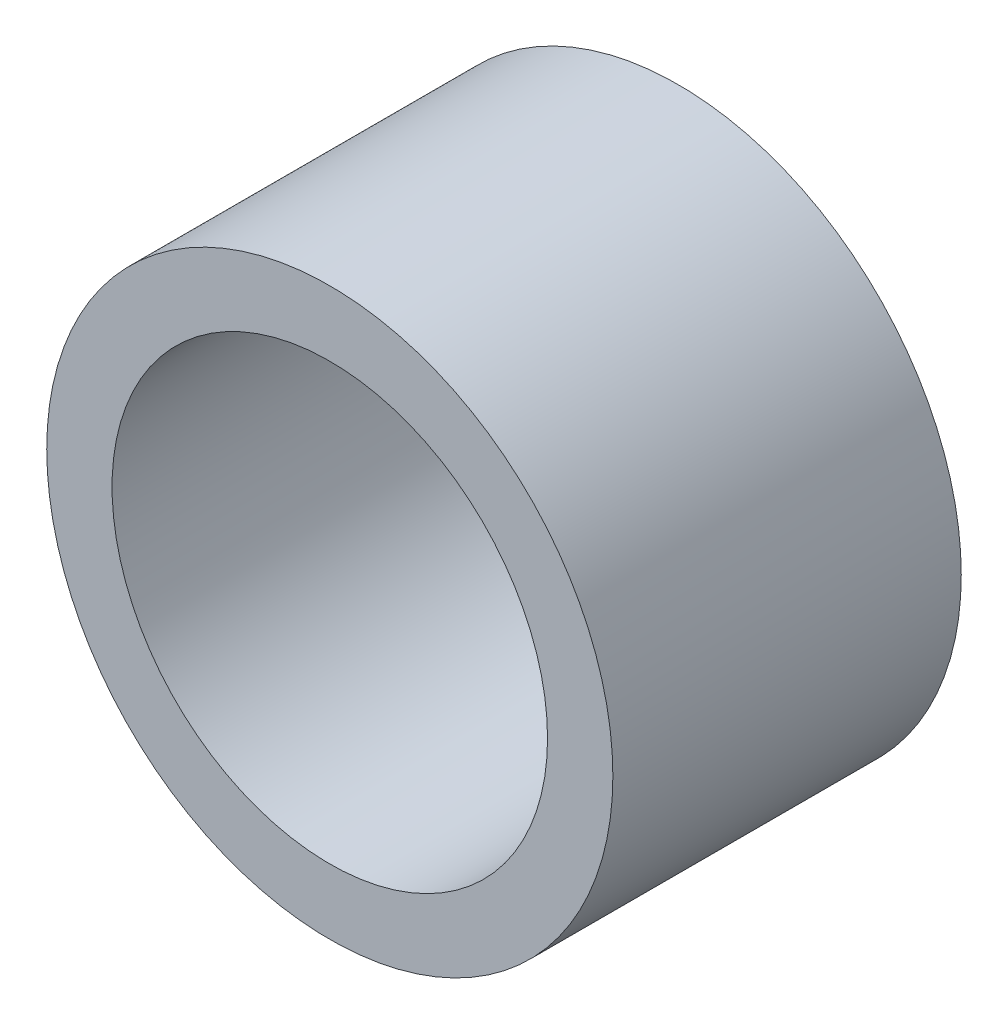
ISO-10303-21;
HEADER;
FILE_DESCRIPTION(('STEP AP214'),'2;1');
FILE_NAME('part.step','',(''),(''),'','','');
FILE_SCHEMA(('AUTOMOTIVE_DESIGN { 1 0 10303 214 1 1 1 1 }'));
ENDSEC;
DATA;
#1=APPLICATION_CONTEXT('core data for automotive mechanical design processes');
#2=APPLICATION_PROTOCOL_DEFINITION('international standard','automotive_design',2000,#1);
#3=PRODUCT_CONTEXT('',#1,'mechanical');
#4=PRODUCT('Part','Part','',(#3));
#5=PRODUCT_RELATED_PRODUCT_CATEGORY('part','',(#4));
#6=PRODUCT_DEFINITION_FORMATION('','',#4);
#7=PRODUCT_DEFINITION_CONTEXT('part definition',#1,'design');
#8=PRODUCT_DEFINITION('design','',#6,#7);
#9=PRODUCT_DEFINITION_SHAPE('','',#8);
#10=(LENGTH_UNIT() NAMED_UNIT(*) SI_UNIT(.MILLI.,.METRE.));
#11=(NAMED_UNIT(*) PLANE_ANGLE_UNIT() SI_UNIT($,.RADIAN.));
#12=(NAMED_UNIT(*) SI_UNIT($,.STERADIAN.) SOLID_ANGLE_UNIT());
#13=UNCERTAINTY_MEASURE_WITH_UNIT(LENGTH_MEASURE(1.E-05),#10,'distance_accuracy_value','');
#14=(GEOMETRIC_REPRESENTATION_CONTEXT(3) GLOBAL_UNCERTAINTY_ASSIGNED_CONTEXT((#13)) GLOBAL_UNIT_ASSIGNED_CONTEXT((#10,
#11,#12)) REPRESENTATION_CONTEXT('',''));
#15=CARTESIAN_POINT('',(0.,0.,0.));
#16=DIRECTION('',(0.,0.,1.));
#17=DIRECTION('',(1.,0.,0.));
#18=AXIS2_PLACEMENT_3D('',#15,#16,#17);
#19=CARTESIAN_POINT('',(0.,0.,12.7));
#20=DIRECTION('',(0.,0.,1.));
#21=DIRECTION('',(1.,0.,0.));
#22=AXIS2_PLACEMENT_3D('',#19,#20,#21);
#23=PLANE('',#22);
#24=CARTESIAN_POINT('',(0.,0.,12.7));
#25=DIRECTION('',(0.,0.,1.));
#26=DIRECTION('',(1.,0.,0.));
#27=AXIS2_PLACEMENT_3D('',#24,#25,#26);
#28=CIRCLE('',#27,10.31875);
#29=CARTESIAN_POINT('',(10.31875,0.,12.7));
#30=VERTEX_POINT('',#29);
#31=EDGE_CURVE('E10',#30,#30,#28,.T.);
#32=ORIENTED_EDGE('',*,*,#31,.T.);
#33=EDGE_LOOP('',(#32));
#34=FACE_BOUND('',#33,.T.);
#35=CARTESIAN_POINT('',(0.,0.,12.7));
#36=DIRECTION('',(0.,0.,1.));
#37=DIRECTION('',(1.,0.,0.));
#38=AXIS2_PLACEMENT_3D('',#35,#36,#37);
#39=CIRCLE('',#38,7.9375);
#40=CARTESIAN_POINT('',(7.9375,0.,12.7));
#41=VERTEX_POINT('',#40);
#42=EDGE_CURVE('E41',#41,#41,#39,.T.);
#43=ORIENTED_EDGE('',*,*,#42,.F.);
#44=EDGE_LOOP('',(#43));
#45=FACE_BOUND('',#44,.T.);
#46=ADVANCED_FACE('F30',(#34,#45),#23,.T.);
#47=CARTESIAN_POINT('',(0.,0.,0.));
#48=DIRECTION('',(0.,0.,1.));
#49=DIRECTION('',(1.,0.,0.));
#50=AXIS2_PLACEMENT_3D('',#47,#48,#49);
#51=PLANE('',#50);
#52=CARTESIAN_POINT('',(0.,0.,0.));
#53=DIRECTION('',(0.,0.,1.));
#54=DIRECTION('',(1.,0.,0.));
#55=AXIS2_PLACEMENT_3D('',#52,#53,#54);
#56=CIRCLE('',#55,10.31875);
#57=CARTESIAN_POINT('',(10.31875,0.,0.));
#58=VERTEX_POINT('',#57);
#59=EDGE_CURVE('E34',#58,#58,#56,.T.);
#60=ORIENTED_EDGE('',*,*,#59,.F.);
#61=EDGE_LOOP('',(#60));
#62=FACE_BOUND('',#61,.T.);
#63=CARTESIAN_POINT('',(0.,0.,0.));
#64=DIRECTION('',(0.,0.,1.));
#65=DIRECTION('',(1.,0.,0.));
#66=AXIS2_PLACEMENT_3D('',#63,#64,#65);
#67=CIRCLE('',#66,7.9375);
#68=CARTESIAN_POINT('',(7.9375,0.,0.));
#69=VERTEX_POINT('',#68);
#70=EDGE_CURVE('E43',#69,#69,#67,.T.);
#71=ORIENTED_EDGE('',*,*,#70,.T.);
#72=EDGE_LOOP('',(#71));
#73=FACE_BOUND('',#72,.T.);
#74=ADVANCED_FACE('F53',(#62,#73),#51,.F.);
#75=CARTESIAN_POINT('',(0.,0.,12.7));
#76=DIRECTION('',(0.,0.,-1.));
#77=DIRECTION('',(-1.,0.,0.));
#78=AXIS2_PLACEMENT_3D('',#75,#76,#77);
#79=CYLINDRICAL_SURFACE('',#78,10.31875);
#80=ORIENTED_EDGE('',*,*,#31,.F.);
#81=EDGE_LOOP('',(#80));
#82=FACE_BOUND('',#81,.T.);
#83=ORIENTED_EDGE('',*,*,#59,.T.);
#84=EDGE_LOOP('',(#83));
#85=FACE_BOUND('',#84,.T.);
#86=ADVANCED_FACE('F32',(#82,#85),#79,.T.);
#87=CARTESIAN_POINT('',(0.,0.,12.7));
#88=DIRECTION('',(0.,0.,-1.));
#89=DIRECTION('',(-1.,0.,0.));
#90=AXIS2_PLACEMENT_3D('',#87,#88,#89);
#91=CYLINDRICAL_SURFACE('',#90,7.9375);
#92=ORIENTED_EDGE('',*,*,#42,.T.);
#93=EDGE_LOOP('',(#92));
#94=FACE_BOUND('',#93,.T.);
#95=ORIENTED_EDGE('',*,*,#70,.F.);
#96=EDGE_LOOP('',(#95));
#97=FACE_BOUND('',#96,.T.);
#98=ADVANCED_FACE('F49',(#94,#97),#91,.F.);
#99=CLOSED_SHELL('',(#46,#74,#86,#98));
#100=MANIFOLD_SOLID_BREP('B2',#99);
#101=ADVANCED_BREP_SHAPE_REPRESENTATION('',(#18,#100),#14);
#102=SHAPE_DEFINITION_REPRESENTATION(#9,#101);
ENDSEC;
END-ISO-10303-21;
